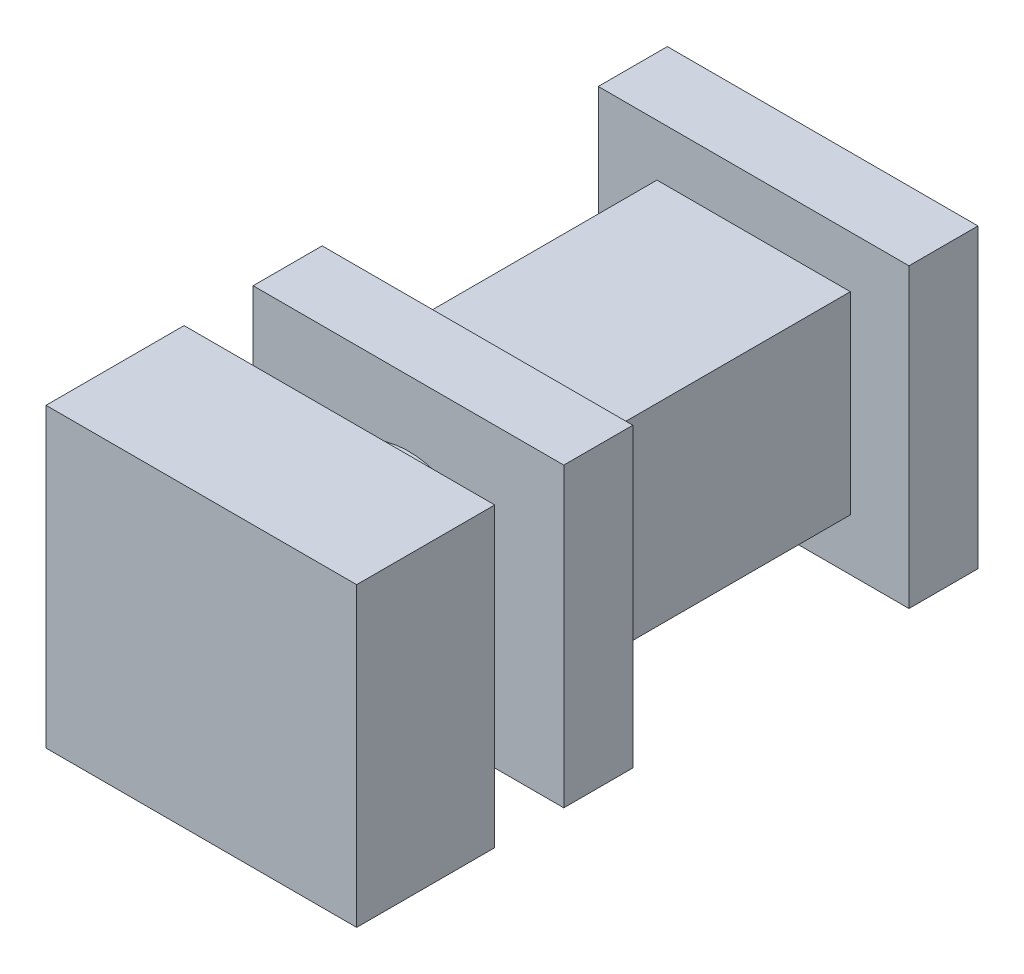
ISO-10303-21;
HEADER;
FILE_DESCRIPTION(('STEP AP214'),'2;1');
FILE_NAME('part.step','',(''),(''),'','','');
FILE_SCHEMA(('AUTOMOTIVE_DESIGN { 1 0 10303 214 1 1 1 1 }'));
ENDSEC;
DATA;
#1=APPLICATION_CONTEXT('core data for automotive mechanical design processes');
#2=APPLICATION_PROTOCOL_DEFINITION('international standard','automotive_design',2000,#1);
#3=PRODUCT_CONTEXT('',#1,'mechanical');
#4=PRODUCT('Part','Part','',(#3));
#5=PRODUCT_RELATED_PRODUCT_CATEGORY('part','',(#4));
#6=PRODUCT_DEFINITION_FORMATION('','',#4);
#7=PRODUCT_DEFINITION_CONTEXT('part definition',#1,'design');
#8=PRODUCT_DEFINITION('design','',#6,#7);
#9=PRODUCT_DEFINITION_SHAPE('','',#8);
#10=(LENGTH_UNIT() NAMED_UNIT(*) SI_UNIT(.MILLI.,.METRE.));
#11=(NAMED_UNIT(*) PLANE_ANGLE_UNIT() SI_UNIT($,.RADIAN.));
#12=(NAMED_UNIT(*) SI_UNIT($,.STERADIAN.) SOLID_ANGLE_UNIT());
#13=UNCERTAINTY_MEASURE_WITH_UNIT(LENGTH_MEASURE(1.E-05),#10,'distance_accuracy_value','');
#14=(GEOMETRIC_REPRESENTATION_CONTEXT(3) GLOBAL_UNCERTAINTY_ASSIGNED_CONTEXT((#13)) GLOBAL_UNIT_ASSIGNED_CONTEXT((#10,
#11,#12)) REPRESENTATION_CONTEXT('',''));
#15=CARTESIAN_POINT('',(0.,0.,0.));
#16=DIRECTION('',(0.,0.,1.));
#17=DIRECTION('',(1.,0.,0.));
#18=AXIS2_PLACEMENT_3D('',#15,#16,#17);
#19=CARTESIAN_POINT('',(0.,0.,-1.));
#20=DIRECTION('',(0.,0.,1.));
#21=DIRECTION('',(1.,0.,0.));
#22=AXIS2_PLACEMENT_3D('',#19,#20,#21);
#23=PLANE('',#22);
#24=DIRECTION('',(0.,1.,0.));
#25=VECTOR('',#24,1.);
#26=CARTESIAN_POINT('',(-1.125,-1.075,-1.));
#27=LINE('',#26,#25);
#28=CARTESIAN_POINT('',(-1.125,-1.075,-1.));
#29=VERTEX_POINT('',#28);
#30=CARTESIAN_POINT('',(-1.125,1.075,-1.));
#31=VERTEX_POINT('',#30);
#32=EDGE_CURVE('E230',#29,#31,#27,.T.);
#33=ORIENTED_EDGE('',*,*,#32,.T.);
#34=DIRECTION('',(1.,0.,0.));
#35=VECTOR('',#34,1.);
#36=CARTESIAN_POINT('',(1.125,1.075,-1.));
#37=LINE('',#36,#35);
#38=CARTESIAN_POINT('',(1.125,1.075,-1.));
#39=VERTEX_POINT('',#38);
#40=EDGE_CURVE('E234',#31,#39,#37,.T.);
#41=ORIENTED_EDGE('',*,*,#40,.T.);
#42=DIRECTION('',(0.,-1.,0.));
#43=VECTOR('',#42,1.);
#44=CARTESIAN_POINT('',(1.125,-1.075,-1.));
#45=LINE('',#44,#43);
#46=CARTESIAN_POINT('',(1.125,-1.075,-1.));
#47=VERTEX_POINT('',#46);
#48=EDGE_CURVE('E238',#39,#47,#45,.T.);
#49=ORIENTED_EDGE('',*,*,#48,.T.);
#50=DIRECTION('',(-1.,0.,0.));
#51=VECTOR('',#50,1.);
#52=CARTESIAN_POINT('',(1.125,-1.075,-1.));
#53=LINE('',#52,#51);
#54=EDGE_CURVE('E241',#47,#29,#53,.T.);
#55=ORIENTED_EDGE('',*,*,#54,.T.);
#56=EDGE_LOOP('',(#33,#41,#49,#55));
#57=FACE_BOUND('',#56,.T.);
#58=DIRECTION('',(0.,1.,0.));
#59=VECTOR('',#58,1.);
#60=CARTESIAN_POINT('',(-0.7,-0.7,-1.));
#61=LINE('',#60,#59);
#62=CARTESIAN_POINT('',(-0.7,-0.7,-1.));
#63=VERTEX_POINT('',#62);
#64=CARTESIAN_POINT('',(-0.7,0.7,-1.));
#65=VERTEX_POINT('',#64);
#66=EDGE_CURVE('E56',#63,#65,#61,.T.);
#67=ORIENTED_EDGE('',*,*,#66,.F.);
#68=DIRECTION('',(-1.,0.,0.));
#69=VECTOR('',#68,1.);
#70=CARTESIAN_POINT('',(0.7,-0.7,-1.));
#71=LINE('',#70,#69);
#72=CARTESIAN_POINT('',(0.7,-0.7,-1.));
#73=VERTEX_POINT('',#72);
#74=EDGE_CURVE('E60',#73,#63,#71,.T.);
#75=ORIENTED_EDGE('',*,*,#74,.F.);
#76=DIRECTION('',(0.,-1.,0.));
#77=VECTOR('',#76,1.);
#78=CARTESIAN_POINT('',(0.7,-0.7,-1.));
#79=LINE('',#78,#77);
#80=CARTESIAN_POINT('',(0.7,0.7,-1.));
#81=VERTEX_POINT('',#80);
#82=EDGE_CURVE('E209',#81,#73,#79,.T.);
#83=ORIENTED_EDGE('',*,*,#82,.F.);
#84=DIRECTION('',(1.,0.,0.));
#85=VECTOR('',#84,1.);
#86=CARTESIAN_POINT('',(0.7,0.7,-1.));
#87=LINE('',#86,#85);
#88=EDGE_CURVE('E183',#65,#81,#87,.T.);
#89=ORIENTED_EDGE('',*,*,#88,.F.);
#90=EDGE_LOOP('',(#67,#75,#83,#89));
#91=FACE_BOUND('',#90,.T.);
#92=ADVANCED_FACE('F39',(#57,#91),#23,.F.);
#93=CARTESIAN_POINT('',(1.125,-1.075,1.));
#94=DIRECTION('',(-1.,0.,0.));
#95=DIRECTION('',(0.,-1.,0.));
#96=AXIS2_PLACEMENT_3D('',#93,#94,#95);
#97=PLANE('',#96);
#98=DIRECTION('',(0.,1.,0.));
#99=VECTOR('',#98,1.);
#100=CARTESIAN_POINT('',(1.125,-1.075,0.));
#101=LINE('',#100,#99);
#102=CARTESIAN_POINT('',(1.125,-1.075,0.));
#103=VERTEX_POINT('',#102);
#104=CARTESIAN_POINT('',(1.125,1.075,0.));
#105=VERTEX_POINT('',#104);
#106=EDGE_CURVE('E274',#103,#105,#101,.T.);
#107=ORIENTED_EDGE('',*,*,#106,.T.);
#108=DIRECTION('',(0.,0.,-1.));
#109=VECTOR('',#108,1.);
#110=CARTESIAN_POINT('',(1.125,1.075,1.));
#111=LINE('',#110,#109);
#112=CARTESIAN_POINT('',(1.125,1.075,1.));
#113=VERTEX_POINT('',#112);
#114=EDGE_CURVE('E43',#113,#105,#111,.T.);
#115=ORIENTED_EDGE('',*,*,#114,.F.);
#116=DIRECTION('',(0.,1.,0.));
#117=VECTOR('',#116,1.);
#118=CARTESIAN_POINT('',(1.125,-1.075,1.));
#119=LINE('',#118,#117);
#120=CARTESIAN_POINT('',(1.125,-1.075,1.));
#121=VERTEX_POINT('',#120);
#122=EDGE_CURVE('E276',#121,#113,#119,.T.);
#123=ORIENTED_EDGE('',*,*,#122,.F.);
#124=DIRECTION('',(0.,0.,-1.));
#125=VECTOR('',#124,1.);
#126=CARTESIAN_POINT('',(1.125,-1.075,1.));
#127=LINE('',#126,#125);
#128=EDGE_CURVE('E290',#121,#103,#127,.T.);
#129=ORIENTED_EDGE('',*,*,#128,.T.);
#130=EDGE_LOOP('',(#107,#115,#123,#129));
#131=FACE_BOUND('',#130,.T.);
#132=ADVANCED_FACE('F41',(#131),#97,.F.);
#133=CARTESIAN_POINT('',(-1.125,1.075,1.));
#134=DIRECTION('',(0.,-1.,0.));
#135=DIRECTION('',(1.,0.,0.));
#136=AXIS2_PLACEMENT_3D('',#133,#134,#135);
#137=PLANE('',#136);
#138=DIRECTION('',(-1.,0.,0.));
#139=VECTOR('',#138,1.);
#140=CARTESIAN_POINT('',(-1.125,1.075,0.));
#141=LINE('',#140,#139);
#142=CARTESIAN_POINT('',(-1.125,1.075,0.));
#143=VERTEX_POINT('',#142);
#144=EDGE_CURVE('E294',#105,#143,#141,.T.);
#145=ORIENTED_EDGE('',*,*,#144,.T.);
#146=DIRECTION('',(0.,0.,-1.));
#147=VECTOR('',#146,1.);
#148=CARTESIAN_POINT('',(-1.125,1.075,1.));
#149=LINE('',#148,#147);
#150=CARTESIAN_POINT('',(-1.125,1.075,1.));
#151=VERTEX_POINT('',#150);
#152=EDGE_CURVE('E308',#151,#143,#149,.T.);
#153=ORIENTED_EDGE('',*,*,#152,.F.);
#154=DIRECTION('',(-1.,0.,0.));
#155=VECTOR('',#154,1.);
#156=CARTESIAN_POINT('',(-1.125,1.075,1.));
#157=LINE('',#156,#155);
#158=EDGE_CURVE('E280',#113,#151,#157,.T.);
#159=ORIENTED_EDGE('',*,*,#158,.F.);
#160=ORIENTED_EDGE('',*,*,#114,.T.);
#161=EDGE_LOOP('',(#145,#153,#159,#160));
#162=FACE_BOUND('',#161,.T.);
#163=ADVANCED_FACE('F319',(#162),#137,.F.);
#164=CARTESIAN_POINT('',(-1.125,-1.075,1.));
#165=DIRECTION('',(1.,0.,0.));
#166=DIRECTION('',(0.,0.,-1.));
#167=AXIS2_PLACEMENT_3D('',#164,#165,#166);
#168=PLANE('',#167);
#169=DIRECTION('',(0.,-1.,0.));
#170=VECTOR('',#169,1.);
#171=CARTESIAN_POINT('',(-1.125,-1.075,0.));
#172=LINE('',#171,#170);
#173=CARTESIAN_POINT('',(-1.125,-1.075,0.));
#174=VERTEX_POINT('',#173);
#175=EDGE_CURVE('E297',#143,#174,#172,.T.);
#176=ORIENTED_EDGE('',*,*,#175,.T.);
#177=DIRECTION('',(0.,0.,-1.));
#178=VECTOR('',#177,1.);
#179=CARTESIAN_POINT('',(-1.125,-1.075,1.));
#180=LINE('',#179,#178);
#181=CARTESIAN_POINT('',(-1.125,-1.075,1.));
#182=VERTEX_POINT('',#181);
#183=EDGE_CURVE('E305',#182,#174,#180,.T.);
#184=ORIENTED_EDGE('',*,*,#183,.F.);
#185=DIRECTION('',(0.,-1.,0.));
#186=VECTOR('',#185,1.);
#187=CARTESIAN_POINT('',(-1.125,-1.075,1.));
#188=LINE('',#187,#186);
#189=EDGE_CURVE('E284',#151,#182,#188,.T.);
#190=ORIENTED_EDGE('',*,*,#189,.F.);
#191=ORIENTED_EDGE('',*,*,#152,.T.);
#192=EDGE_LOOP('',(#176,#184,#190,#191));
#193=FACE_BOUND('',#192,.T.);
#194=ADVANCED_FACE('F328',(#193),#168,.F.);
#195=CARTESIAN_POINT('',(-1.125,-1.075,1.));
#196=DIRECTION('',(0.,1.,0.));
#197=DIRECTION('',(-1.,0.,0.));
#198=AXIS2_PLACEMENT_3D('',#195,#196,#197);
#199=PLANE('',#198);
#200=DIRECTION('',(1.,0.,0.));
#201=VECTOR('',#200,1.);
#202=CARTESIAN_POINT('',(-1.125,-1.075,0.));
#203=LINE('',#202,#201);
#204=EDGE_CURVE('E281',#174,#103,#203,.T.);
#205=ORIENTED_EDGE('',*,*,#204,.T.);
#206=ORIENTED_EDGE('',*,*,#128,.F.);
#207=DIRECTION('',(1.,0.,0.));
#208=VECTOR('',#207,1.);
#209=CARTESIAN_POINT('',(-1.125,-1.075,1.));
#210=LINE('',#209,#208);
#211=EDGE_CURVE('E287',#182,#121,#210,.T.);
#212=ORIENTED_EDGE('',*,*,#211,.F.);
#213=ORIENTED_EDGE('',*,*,#183,.T.);
#214=EDGE_LOOP('',(#205,#206,#212,#213));
#215=FACE_BOUND('',#214,.T.);
#216=ADVANCED_FACE('F331',(#215),#199,.F.);
#217=CARTESIAN_POINT('',(0.,0.,1.));
#218=DIRECTION('',(0.,0.,-1.));
#219=DIRECTION('',(-1.,0.,0.));
#220=AXIS2_PLACEMENT_3D('',#217,#218,#219);
#221=PLANE('',#220);
#222=ORIENTED_EDGE('',*,*,#122,.T.);
#223=ORIENTED_EDGE('',*,*,#158,.T.);
#224=ORIENTED_EDGE('',*,*,#189,.T.);
#225=ORIENTED_EDGE('',*,*,#211,.T.);
#226=EDGE_LOOP('',(#222,#223,#224,#225));
#227=FACE_BOUND('',#226,.T.);
#228=ADVANCED_FACE('F333',(#227),#221,.F.);
#229=CARTESIAN_POINT('',(0.,0.,0.));
#230=DIRECTION('',(0.,0.,-1.));
#231=DIRECTION('',(-1.,0.,0.));
#232=AXIS2_PLACEMENT_3D('',#229,#230,#231);
#233=PLANE('',#232);
#234=CARTESIAN_POINT('',(0.,0.,0.));
#235=DIRECTION('',(0.,0.,-1.));
#236=DIRECTION('',(-1.,0.,0.));
#237=AXIS2_PLACEMENT_3D('',#234,#235,#236);
#238=CIRCLE('',#237,0.6);
#239=CARTESIAN_POINT('',(-0.6,0.,0.));
#240=VERTEX_POINT('',#239);
#241=EDGE_CURVE('E11',#240,#240,#238,.T.);
#242=ORIENTED_EDGE('',*,*,#241,.F.);
#243=EDGE_LOOP('',(#242));
#244=FACE_BOUND('',#243,.T.);
#245=ORIENTED_EDGE('',*,*,#106,.F.);
#246=ORIENTED_EDGE('',*,*,#204,.F.);
#247=ORIENTED_EDGE('',*,*,#175,.F.);
#248=ORIENTED_EDGE('',*,*,#144,.F.);
#249=EDGE_LOOP('',(#245,#246,#247,#248));
#250=FACE_BOUND('',#249,.T.);
#251=ADVANCED_FACE('F326',(#244,#250),#233,.T.);
#252=CARTESIAN_POINT('',(0.,0.,-0.5));
#253=DIRECTION('',(0.,0.,1.));
#254=DIRECTION('',(1.,0.,0.));
#255=AXIS2_PLACEMENT_3D('',#252,#253,#254);
#256=CYLINDRICAL_SURFACE('',#255,0.6);
#257=CARTESIAN_POINT('',(0.,0.,-0.5));
#258=DIRECTION('',(0.,0.,-1.));
#259=DIRECTION('',(-1.,0.,0.));
#260=AXIS2_PLACEMENT_3D('',#257,#258,#259);
#261=CIRCLE('',#260,0.6);
#262=CARTESIAN_POINT('',(-0.6,0.,-0.5));
#263=VERTEX_POINT('',#262);
#264=EDGE_CURVE('E271',#263,#263,#261,.T.);
#265=ORIENTED_EDGE('',*,*,#264,.F.);
#266=EDGE_LOOP('',(#265));
#267=FACE_BOUND('',#266,.T.);
#268=ORIENTED_EDGE('',*,*,#241,.T.);
#269=EDGE_LOOP('',(#268));
#270=FACE_BOUND('',#269,.T.);
#271=ADVANCED_FACE('F340',(#267,#270),#256,.T.);
#272=CARTESIAN_POINT('',(-1.125,-1.075,-1.));
#273=DIRECTION('',(1.,0.,0.));
#274=DIRECTION('',(0.,1.,0.));
#275=AXIS2_PLACEMENT_3D('',#272,#273,#274);
#276=PLANE('',#275);
#277=DIRECTION('',(0.,1.,0.));
#278=VECTOR('',#277,1.);
#279=CARTESIAN_POINT('',(-1.125,-1.075,-0.5));
#280=LINE('',#279,#278);
#281=CARTESIAN_POINT('',(-1.125,-1.075,-0.5));
#282=VERTEX_POINT('',#281);
#283=CARTESIAN_POINT('',(-1.125,1.075,-0.5));
#284=VERTEX_POINT('',#283);
#285=EDGE_CURVE('E229',#282,#284,#280,.T.);
#286=ORIENTED_EDGE('',*,*,#285,.T.);
#287=DIRECTION('',(0.,0.,1.));
#288=VECTOR('',#287,1.);
#289=CARTESIAN_POINT('',(-1.125,1.075,-1.));
#290=LINE('',#289,#288);
#291=EDGE_CURVE('E267',#31,#284,#290,.T.);
#292=ORIENTED_EDGE('',*,*,#291,.F.);
#293=ORIENTED_EDGE('',*,*,#32,.F.);
#294=DIRECTION('',(0.,0.,1.));
#295=VECTOR('',#294,1.);
#296=CARTESIAN_POINT('',(-1.125,-1.075,-1.));
#297=LINE('',#296,#295);
#298=EDGE_CURVE('E244',#29,#282,#297,.T.);
#299=ORIENTED_EDGE('',*,*,#298,.T.);
#300=EDGE_LOOP('',(#286,#292,#293,#299));
#301=FACE_BOUND('',#300,.T.);
#302=ADVANCED_FACE('F370',(#301),#276,.F.);
#303=CARTESIAN_POINT('',(1.125,1.075,-1.));
#304=DIRECTION('',(0.,-1.,0.));
#305=DIRECTION('',(0.,0.,-1.));
#306=AXIS2_PLACEMENT_3D('',#303,#304,#305);
#307=PLANE('',#306);
#308=DIRECTION('',(1.,0.,0.));
#309=VECTOR('',#308,1.);
#310=CARTESIAN_POINT('',(1.125,1.075,-0.5));
#311=LINE('',#310,#309);
#312=CARTESIAN_POINT('',(1.125,1.075,-0.5));
#313=VERTEX_POINT('',#312);
#314=EDGE_CURVE('E248',#284,#313,#311,.T.);
#315=ORIENTED_EDGE('',*,*,#314,.T.);
#316=DIRECTION('',(0.,0.,1.));
#317=VECTOR('',#316,1.);
#318=CARTESIAN_POINT('',(1.125,1.075,-1.));
#319=LINE('',#318,#317);
#320=EDGE_CURVE('E263',#39,#313,#319,.T.);
#321=ORIENTED_EDGE('',*,*,#320,.F.);
#322=ORIENTED_EDGE('',*,*,#40,.F.);
#323=ORIENTED_EDGE('',*,*,#291,.T.);
#324=EDGE_LOOP('',(#315,#321,#322,#323));
#325=FACE_BOUND('',#324,.T.);
#326=ADVANCED_FACE('F366',(#325),#307,.F.);
#327=CARTESIAN_POINT('',(1.125,-1.075,-1.));
#328=DIRECTION('',(-1.,0.,0.));
#329=DIRECTION('',(0.,-1.,0.));
#330=AXIS2_PLACEMENT_3D('',#327,#328,#329);
#331=PLANE('',#330);
#332=DIRECTION('',(0.,-1.,0.));
#333=VECTOR('',#332,1.);
#334=CARTESIAN_POINT('',(1.125,-1.075,-0.5));
#335=LINE('',#334,#333);
#336=CARTESIAN_POINT('',(1.125,-1.075,-0.5));
#337=VERTEX_POINT('',#336);
#338=EDGE_CURVE('E251',#313,#337,#335,.T.);
#339=ORIENTED_EDGE('',*,*,#338,.T.);
#340=DIRECTION('',(0.,0.,1.));
#341=VECTOR('',#340,1.);
#342=CARTESIAN_POINT('',(1.125,-1.075,-1.));
#343=LINE('',#342,#341);
#344=EDGE_CURVE('E259',#47,#337,#343,.T.);
#345=ORIENTED_EDGE('',*,*,#344,.F.);
#346=ORIENTED_EDGE('',*,*,#48,.F.);
#347=ORIENTED_EDGE('',*,*,#320,.T.);
#348=EDGE_LOOP('',(#339,#345,#346,#347));
#349=FACE_BOUND('',#348,.T.);
#350=ADVANCED_FACE('F362',(#349),#331,.F.);
#351=CARTESIAN_POINT('',(1.125,-1.075,-1.));
#352=DIRECTION('',(0.,1.,0.));
#353=DIRECTION('',(0.,0.,1.));
#354=AXIS2_PLACEMENT_3D('',#351,#352,#353);
#355=PLANE('',#354);
#356=DIRECTION('',(-1.,0.,0.));
#357=VECTOR('',#356,1.);
#358=CARTESIAN_POINT('',(1.125,-1.075,-0.5));
#359=LINE('',#358,#357);
#360=EDGE_CURVE('E235',#337,#282,#359,.T.);
#361=ORIENTED_EDGE('',*,*,#360,.T.);
#362=ORIENTED_EDGE('',*,*,#298,.F.);
#363=ORIENTED_EDGE('',*,*,#54,.F.);
#364=ORIENTED_EDGE('',*,*,#344,.T.);
#365=EDGE_LOOP('',(#361,#362,#363,#364));
#366=FACE_BOUND('',#365,.T.);
#367=ADVANCED_FACE('F358',(#366),#355,.F.);
#368=CARTESIAN_POINT('',(0.,0.,-0.5));
#369=DIRECTION('',(0.,0.,1.));
#370=DIRECTION('',(1.,0.,0.));
#371=AXIS2_PLACEMENT_3D('',#368,#369,#370);
#372=PLANE('',#371);
#373=ORIENTED_EDGE('',*,*,#264,.T.);
#374=EDGE_LOOP('',(#373));
#375=FACE_BOUND('',#374,.T.);
#376=ORIENTED_EDGE('',*,*,#285,.F.);
#377=ORIENTED_EDGE('',*,*,#360,.F.);
#378=ORIENTED_EDGE('',*,*,#338,.F.);
#379=ORIENTED_EDGE('',*,*,#314,.F.);
#380=EDGE_LOOP('',(#376,#377,#378,#379));
#381=FACE_BOUND('',#380,.T.);
#382=ADVANCED_FACE('F355',(#375,#381),#372,.T.);
#383=CARTESIAN_POINT('',(-0.7,-0.7,-3.));
#384=DIRECTION('',(1.,0.,0.));
#385=DIRECTION('',(0.,0.,-1.));
#386=AXIS2_PLACEMENT_3D('',#383,#384,#385);
#387=PLANE('',#386);
#388=ORIENTED_EDGE('',*,*,#66,.T.);
#389=DIRECTION('',(0.,0.,1.));
#390=VECTOR('',#389,1.);
#391=CARTESIAN_POINT('',(-0.7,0.7,-3.));
#392=LINE('',#391,#390);
#393=CARTESIAN_POINT('',(-0.7,0.7,-3.));
#394=VERTEX_POINT('',#393);
#395=EDGE_CURVE('E225',#394,#65,#392,.T.);
#396=ORIENTED_EDGE('',*,*,#395,.F.);
#397=DIRECTION('',(0.,1.,0.));
#398=VECTOR('',#397,1.);
#399=CARTESIAN_POINT('',(-0.7,-0.7,-3.));
#400=LINE('',#399,#398);
#401=CARTESIAN_POINT('',(-0.7,-0.7,-3.));
#402=VERTEX_POINT('',#401);
#403=EDGE_CURVE('E189',#402,#394,#400,.T.);
#404=ORIENTED_EDGE('',*,*,#403,.F.);
#405=DIRECTION('',(0.,0.,1.));
#406=VECTOR('',#405,1.);
#407=CARTESIAN_POINT('',(-0.7,-0.7,-3.));
#408=LINE('',#407,#406);
#409=EDGE_CURVE('E204',#402,#63,#408,.T.);
#410=ORIENTED_EDGE('',*,*,#409,.T.);
#411=EDGE_LOOP('',(#388,#396,#404,#410));
#412=FACE_BOUND('',#411,.T.);
#413=ADVANCED_FACE('F353',(#412),#387,.F.);
#414=CARTESIAN_POINT('',(0.7,0.7,-3.));
#415=DIRECTION('',(0.,-1.,0.));
#416=DIRECTION('',(1.,0.,0.));
#417=AXIS2_PLACEMENT_3D('',#414,#415,#416);
#418=PLANE('',#417);
#419=ORIENTED_EDGE('',*,*,#88,.T.);
#420=DIRECTION('',(0.,0.,1.));
#421=VECTOR('',#420,1.);
#422=CARTESIAN_POINT('',(0.7,0.7,-3.));
#423=LINE('',#422,#421);
#424=CARTESIAN_POINT('',(0.7,0.7,-3.));
#425=VERTEX_POINT('',#424);
#426=EDGE_CURVE('E221',#425,#81,#423,.T.);
#427=ORIENTED_EDGE('',*,*,#426,.F.);
#428=DIRECTION('',(1.,0.,0.));
#429=VECTOR('',#428,1.);
#430=CARTESIAN_POINT('',(0.7,0.7,-3.));
#431=LINE('',#430,#429);
#432=EDGE_CURVE('E193',#394,#425,#431,.T.);
#433=ORIENTED_EDGE('',*,*,#432,.F.);
#434=ORIENTED_EDGE('',*,*,#395,.T.);
#435=EDGE_LOOP('',(#419,#427,#433,#434));
#436=FACE_BOUND('',#435,.T.);
#437=ADVANCED_FACE('F420',(#436),#418,.F.);
#438=CARTESIAN_POINT('',(0.7,-0.7,-3.));
#439=DIRECTION('',(-1.,0.,0.));
#440=DIRECTION('',(0.,0.,1.));
#441=AXIS2_PLACEMENT_3D('',#438,#439,#440);
#442=PLANE('',#441);
#443=ORIENTED_EDGE('',*,*,#82,.T.);
#444=DIRECTION('',(0.,0.,1.));
#445=VECTOR('',#444,1.);
#446=CARTESIAN_POINT('',(0.7,-0.7,-3.));
#447=LINE('',#446,#445);
#448=CARTESIAN_POINT('',(0.7,-0.7,-3.));
#449=VERTEX_POINT('',#448);
#450=EDGE_CURVE('E217',#449,#73,#447,.T.);
#451=ORIENTED_EDGE('',*,*,#450,.F.);
#452=DIRECTION('',(0.,-1.,0.));
#453=VECTOR('',#452,1.);
#454=CARTESIAN_POINT('',(0.7,-0.7,-3.));
#455=LINE('',#454,#453);
#456=EDGE_CURVE('E197',#425,#449,#455,.T.);
#457=ORIENTED_EDGE('',*,*,#456,.F.);
#458=ORIENTED_EDGE('',*,*,#426,.T.);
#459=EDGE_LOOP('',(#443,#451,#457,#458));
#460=FACE_BOUND('',#459,.T.);
#461=ADVANCED_FACE('F427',(#460),#442,.F.);
#462=CARTESIAN_POINT('',(0.7,-0.7,-3.));
#463=DIRECTION('',(0.,1.,0.));
#464=DIRECTION('',(-1.,0.,0.));
#465=AXIS2_PLACEMENT_3D('',#462,#463,#464);
#466=PLANE('',#465);
#467=ORIENTED_EDGE('',*,*,#74,.T.);
#468=ORIENTED_EDGE('',*,*,#409,.F.);
#469=DIRECTION('',(-1.,0.,0.));
#470=VECTOR('',#469,1.);
#471=CARTESIAN_POINT('',(0.7,-0.7,-3.));
#472=LINE('',#471,#470);
#473=EDGE_CURVE('E201',#449,#402,#472,.T.);
#474=ORIENTED_EDGE('',*,*,#473,.F.);
#475=ORIENTED_EDGE('',*,*,#450,.T.);
#476=EDGE_LOOP('',(#467,#468,#474,#475));
#477=FACE_BOUND('',#476,.T.);
#478=ADVANCED_FACE('F434',(#477),#466,.F.);
#479=CARTESIAN_POINT('',(-1.125,-1.075,-3.5));
#480=DIRECTION('',(1.,0.,0.));
#481=DIRECTION('',(0.,0.,-1.));
#482=AXIS2_PLACEMENT_3D('',#479,#480,#481);
#483=PLANE('',#482);
#484=DIRECTION('',(0.,1.,0.));
#485=VECTOR('',#484,1.);
#486=CARTESIAN_POINT('',(-1.125,-1.075,-3.));
#487=LINE('',#486,#485);
#488=CARTESIAN_POINT('',(-1.125,-1.075,-3.));
#489=VERTEX_POINT('',#488);
#490=CARTESIAN_POINT('',(-1.125,1.075,-3.));
#491=VERTEX_POINT('',#490);
#492=EDGE_CURVE('E178',#489,#491,#487,.T.);
#493=ORIENTED_EDGE('',*,*,#492,.T.);
#494=DIRECTION('',(0.,0.,1.));
#495=VECTOR('',#494,1.);
#496=CARTESIAN_POINT('',(-1.125,1.075,-3.5));
#497=LINE('',#496,#495);
#498=CARTESIAN_POINT('',(-1.125,1.075,-3.5));
#499=VERTEX_POINT('',#498);
#500=EDGE_CURVE('E156',#499,#491,#497,.T.);
#501=ORIENTED_EDGE('',*,*,#500,.F.);
#502=DIRECTION('',(0.,1.,0.));
#503=VECTOR('',#502,1.);
#504=CARTESIAN_POINT('',(-1.125,-1.075,-3.5));
#505=LINE('',#504,#503);
#506=CARTESIAN_POINT('',(-1.125,-1.075,-3.5));
#507=VERTEX_POINT('',#506);
#508=EDGE_CURVE('E164',#507,#499,#505,.T.);
#509=ORIENTED_EDGE('',*,*,#508,.F.);
#510=DIRECTION('',(0.,0.,1.));
#511=VECTOR('',#510,1.);
#512=CARTESIAN_POINT('',(-1.125,-1.075,-3.5));
#513=LINE('',#512,#511);
#514=EDGE_CURVE('E575',#507,#489,#513,.T.);
#515=ORIENTED_EDGE('',*,*,#514,.T.);
#516=EDGE_LOOP('',(#493,#501,#509,#515));
#517=FACE_BOUND('',#516,.T.);
#518=ADVANCED_FACE('F176',(#517),#483,.F.);
#519=CARTESIAN_POINT('',(1.125,1.075,-3.5));
#520=DIRECTION('',(0.,-1.,0.));
#521=DIRECTION('',(0.,0.,-1.));
#522=AXIS2_PLACEMENT_3D('',#519,#520,#521);
#523=PLANE('',#522);
#524=DIRECTION('',(1.,0.,0.));
#525=VECTOR('',#524,1.);
#526=CARTESIAN_POINT('',(1.125,1.075,-3.));
#527=LINE('',#526,#525);
#528=CARTESIAN_POINT('',(1.125,1.075,-3.));
#529=VERTEX_POINT('',#528);
#530=EDGE_CURVE('E562',#491,#529,#527,.T.);
#531=ORIENTED_EDGE('',*,*,#530,.T.);
#532=DIRECTION('',(0.,0.,1.));
#533=VECTOR('',#532,1.);
#534=CARTESIAN_POINT('',(1.125,1.075,-3.5));
#535=LINE('',#534,#533);
#536=CARTESIAN_POINT('',(1.125,1.075,-3.5));
#537=VERTEX_POINT('',#536);
#538=EDGE_CURVE('E159',#537,#529,#535,.T.);
#539=ORIENTED_EDGE('',*,*,#538,.F.);
#540=DIRECTION('',(1.,0.,0.));
#541=VECTOR('',#540,1.);
#542=CARTESIAN_POINT('',(1.125,1.075,-3.5));
#543=LINE('',#542,#541);
#544=EDGE_CURVE('E152',#499,#537,#543,.T.);
#545=ORIENTED_EDGE('',*,*,#544,.F.);
#546=ORIENTED_EDGE('',*,*,#500,.T.);
#547=EDGE_LOOP('',(#531,#539,#545,#546));
#548=FACE_BOUND('',#547,.T.);
#549=ADVANCED_FACE('F154',(#548),#523,.F.);
#550=CARTESIAN_POINT('',(1.125,-1.075,-3.5));
#551=DIRECTION('',(-1.,0.,0.));
#552=DIRECTION('',(0.,0.,1.));
#553=AXIS2_PLACEMENT_3D('',#550,#551,#552);
#554=PLANE('',#553);
#555=DIRECTION('',(0.,-1.,0.));
#556=VECTOR('',#555,1.);
#557=CARTESIAN_POINT('',(1.125,-1.075,-3.));
#558=LINE('',#557,#556);
#559=CARTESIAN_POINT('',(1.125,-1.075,-3.));
#560=VERTEX_POINT('',#559);
#561=EDGE_CURVE('E566',#529,#560,#558,.T.);
#562=ORIENTED_EDGE('',*,*,#561,.T.);
#563=DIRECTION('',(0.,0.,1.));
#564=VECTOR('',#563,1.);
#565=CARTESIAN_POINT('',(1.125,-1.075,-3.5));
#566=LINE('',#565,#564);
#567=CARTESIAN_POINT('',(1.125,-1.075,-3.5));
#568=VERTEX_POINT('',#567);
#569=EDGE_CURVE('E185',#568,#560,#566,.T.);
#570=ORIENTED_EDGE('',*,*,#569,.F.);
#571=DIRECTION('',(0.,-1.,0.));
#572=VECTOR('',#571,1.);
#573=CARTESIAN_POINT('',(1.125,-1.075,-3.5));
#574=LINE('',#573,#572);
#575=EDGE_CURVE('E163',#537,#568,#574,.T.);
#576=ORIENTED_EDGE('',*,*,#575,.F.);
#577=ORIENTED_EDGE('',*,*,#538,.T.);
#578=EDGE_LOOP('',(#562,#570,#576,#577));
#579=FACE_BOUND('',#578,.T.);
#580=ADVANCED_FACE('F455',(#579),#554,.F.);
#581=CARTESIAN_POINT('',(1.125,-1.075,-3.5));
#582=DIRECTION('',(0.,1.,0.));
#583=DIRECTION('',(0.,0.,1.));
#584=AXIS2_PLACEMENT_3D('',#581,#582,#583);
#585=PLANE('',#584);
#586=DIRECTION('',(-1.,0.,0.));
#587=VECTOR('',#586,1.);
#588=CARTESIAN_POINT('',(1.125,-1.075,-3.));
#589=LINE('',#588,#587);
#590=EDGE_CURVE('E174',#560,#489,#589,.T.);
#591=ORIENTED_EDGE('',*,*,#590,.T.);
#592=ORIENTED_EDGE('',*,*,#514,.F.);
#593=DIRECTION('',(-1.,0.,0.));
#594=VECTOR('',#593,1.);
#595=CARTESIAN_POINT('',(1.125,-1.075,-3.5));
#596=LINE('',#595,#594);
#597=EDGE_CURVE('E169',#568,#507,#596,.T.);
#598=ORIENTED_EDGE('',*,*,#597,.F.);
#599=ORIENTED_EDGE('',*,*,#569,.T.);
#600=EDGE_LOOP('',(#591,#592,#598,#599));
#601=FACE_BOUND('',#600,.T.);
#602=ADVANCED_FACE('F462',(#601),#585,.F.);
#603=CARTESIAN_POINT('',(0.,0.,-3.5));
#604=DIRECTION('',(0.,0.,1.));
#605=DIRECTION('',(1.,0.,0.));
#606=AXIS2_PLACEMENT_3D('',#603,#604,#605);
#607=PLANE('',#606);
#608=ORIENTED_EDGE('',*,*,#508,.T.);
#609=ORIENTED_EDGE('',*,*,#544,.T.);
#610=ORIENTED_EDGE('',*,*,#575,.T.);
#611=ORIENTED_EDGE('',*,*,#597,.T.);
#612=EDGE_LOOP('',(#608,#609,#610,#611));
#613=FACE_BOUND('',#612,.T.);
#614=ADVANCED_FACE('F167',(#613),#607,.F.);
#615=CARTESIAN_POINT('',(0.,0.,-3.));
#616=DIRECTION('',(0.,0.,1.));
#617=DIRECTION('',(1.,0.,0.));
#618=AXIS2_PLACEMENT_3D('',#615,#616,#617);
#619=PLANE('',#618);
#620=ORIENTED_EDGE('',*,*,#473,.T.);
#621=ORIENTED_EDGE('',*,*,#403,.T.);
#622=ORIENTED_EDGE('',*,*,#432,.T.);
#623=ORIENTED_EDGE('',*,*,#456,.T.);
#624=EDGE_LOOP('',(#620,#621,#622,#623));
#625=FACE_BOUND('',#624,.T.);
#626=ORIENTED_EDGE('',*,*,#492,.F.);
#627=ORIENTED_EDGE('',*,*,#590,.F.);
#628=ORIENTED_EDGE('',*,*,#561,.F.);
#629=ORIENTED_EDGE('',*,*,#530,.F.);
#630=EDGE_LOOP('',(#626,#627,#628,#629));
#631=FACE_BOUND('',#630,.T.);
#632=ADVANCED_FACE('F477',(#625,#631),#619,.T.);
#633=CLOSED_SHELL('',(#92,#132,#163,#194,#216,#228,#251,#271,#302,#326,#350,#367,#382,#413,#437,
#461,#478,#518,#549,#580,#602,#614,#632));
#634=MANIFOLD_SOLID_BREP('B2',#633);
#635=ADVANCED_BREP_SHAPE_REPRESENTATION('',(#18,#634),#14);
#636=SHAPE_DEFINITION_REPRESENTATION(#9,#635);
ENDSEC;
END-ISO-10303-21;
